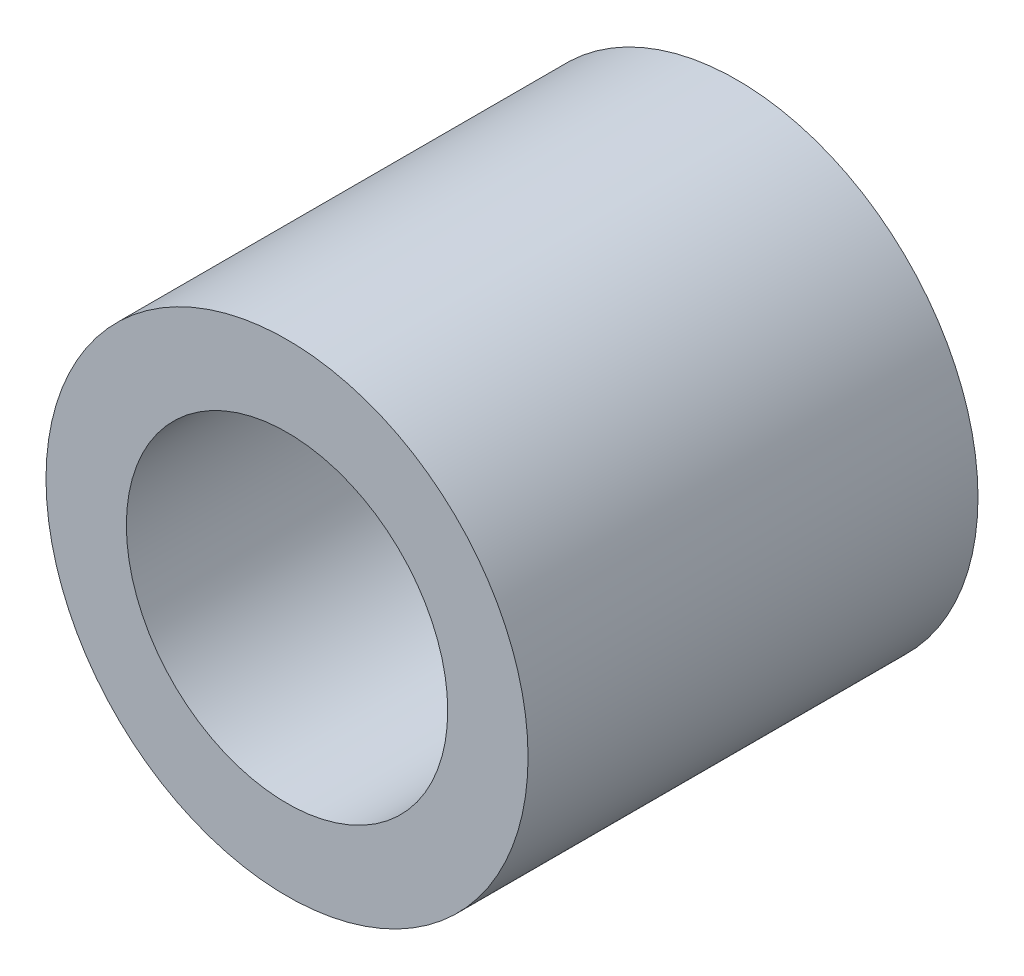
ISO-10303-21;
HEADER;
FILE_DESCRIPTION(('STEP AP214'),'2;1');
FILE_NAME('part.step','',(''),(''),'','','');
FILE_SCHEMA(('AUTOMOTIVE_DESIGN { 1 0 10303 214 1 1 1 1 }'));
ENDSEC;
DATA;
#1=APPLICATION_CONTEXT('core data for automotive mechanical design processes');
#2=APPLICATION_PROTOCOL_DEFINITION('international standard','automotive_design',2000,#1);
#3=PRODUCT_CONTEXT('',#1,'mechanical');
#4=PRODUCT('Part','Part','',(#3));
#5=PRODUCT_RELATED_PRODUCT_CATEGORY('part','',(#4));
#6=PRODUCT_DEFINITION_FORMATION('','',#4);
#7=PRODUCT_DEFINITION_CONTEXT('part definition',#1,'design');
#8=PRODUCT_DEFINITION('design','',#6,#7);
#9=PRODUCT_DEFINITION_SHAPE('','',#8);
#10=(LENGTH_UNIT() NAMED_UNIT(*) SI_UNIT(.MILLI.,.METRE.));
#11=(NAMED_UNIT(*) PLANE_ANGLE_UNIT() SI_UNIT($,.RADIAN.));
#12=(NAMED_UNIT(*) SI_UNIT($,.STERADIAN.) SOLID_ANGLE_UNIT());
#13=UNCERTAINTY_MEASURE_WITH_UNIT(LENGTH_MEASURE(1.E-05),#10,'distance_accuracy_value','');
#14=(GEOMETRIC_REPRESENTATION_CONTEXT(3) GLOBAL_UNCERTAINTY_ASSIGNED_CONTEXT((#13)) GLOBAL_UNIT_ASSIGNED_CONTEXT((#10,
#11,#12)) REPRESENTATION_CONTEXT('',''));
#15=CARTESIAN_POINT('',(0.,0.,0.));
#16=DIRECTION('',(0.,0.,1.));
#17=DIRECTION('',(1.,0.,0.));
#18=AXIS2_PLACEMENT_3D('',#15,#16,#17);
#19=CARTESIAN_POINT('',(0.,0.,7.));
#20=DIRECTION('',(0.,0.,-1.));
#21=DIRECTION('',(-1.,0.,0.));
#22=AXIS2_PLACEMENT_3D('',#19,#20,#21);
#23=CYLINDRICAL_SURFACE('',#22,3.75);
#24=CARTESIAN_POINT('',(0.,0.,7.));
#25=DIRECTION('',(0.,0.,1.));
#26=DIRECTION('',(1.,0.,0.));
#27=AXIS2_PLACEMENT_3D('',#24,#25,#26);
#28=CIRCLE('',#27,3.75);
#29=CARTESIAN_POINT('',(3.75,0.,7.));
#30=VERTEX_POINT('',#29);
#31=EDGE_CURVE('E10',#30,#30,#28,.T.);
#32=ORIENTED_EDGE('',*,*,#31,.F.);
#33=EDGE_LOOP('',(#32));
#34=FACE_BOUND('',#33,.T.);
#35=CARTESIAN_POINT('',(0.,0.,0.));
#36=DIRECTION('',(0.,0.,1.));
#37=DIRECTION('',(1.,0.,0.));
#38=AXIS2_PLACEMENT_3D('',#35,#36,#37);
#39=CIRCLE('',#38,3.75);
#40=CARTESIAN_POINT('',(3.75,0.,0.));
#41=VERTEX_POINT('',#40);
#42=EDGE_CURVE('E46',#41,#41,#39,.T.);
#43=ORIENTED_EDGE('',*,*,#42,.T.);
#44=EDGE_LOOP('',(#43));
#45=FACE_BOUND('',#44,.T.);
#46=ADVANCED_FACE('F43',(#34,#45),#23,.T.);
#47=CARTESIAN_POINT('',(0.,0.,7.));
#48=DIRECTION('',(0.,0.,1.));
#49=DIRECTION('',(1.,0.,0.));
#50=AXIS2_PLACEMENT_3D('',#47,#48,#49);
#51=PLANE('',#50);
#52=CARTESIAN_POINT('',(0.,0.,7.));
#53=DIRECTION('',(0.,0.,1.));
#54=DIRECTION('',(1.,0.,0.));
#55=AXIS2_PLACEMENT_3D('',#52,#53,#54);
#56=CIRCLE('',#55,2.5);
#57=CARTESIAN_POINT('',(2.5,0.,7.));
#58=VERTEX_POINT('',#57);
#59=EDGE_CURVE('E57',#58,#58,#56,.T.);
#60=ORIENTED_EDGE('',*,*,#59,.F.);
#61=EDGE_LOOP('',(#60));
#62=FACE_BOUND('',#61,.T.);
#63=ORIENTED_EDGE('',*,*,#31,.T.);
#64=EDGE_LOOP('',(#63));
#65=FACE_BOUND('',#64,.T.);
#66=ADVANCED_FACE('F74',(#62,#65),#51,.T.);
#67=CARTESIAN_POINT('',(0.,0.,0.));
#68=DIRECTION('',(0.,0.,1.));
#69=DIRECTION('',(1.,0.,0.));
#70=AXIS2_PLACEMENT_3D('',#67,#68,#69);
#71=PLANE('',#70);
#72=ORIENTED_EDGE('',*,*,#42,.F.);
#73=EDGE_LOOP('',(#72));
#74=FACE_BOUND('',#73,.T.);
#75=ADVANCED_FACE('F70',(#74),#71,.F.);
#76=CARTESIAN_POINT('',(0.,0.,2.));
#77=DIRECTION('',(0.,0.,1.));
#78=DIRECTION('',(1.,0.,0.));
#79=AXIS2_PLACEMENT_3D('',#76,#77,#78);
#80=CYLINDRICAL_SURFACE('',#79,2.5);
#81=CARTESIAN_POINT('',(0.,0.,2.));
#82=DIRECTION('',(0.,0.,1.));
#83=DIRECTION('',(1.,0.,0.));
#84=AXIS2_PLACEMENT_3D('',#81,#82,#83);
#85=CIRCLE('',#84,2.5);
#86=CARTESIAN_POINT('',(2.5,0.,2.));
#87=VERTEX_POINT('',#86);
#88=EDGE_CURVE('E55',#87,#87,#85,.T.);
#89=ORIENTED_EDGE('',*,*,#88,.F.);
#90=EDGE_LOOP('',(#89));
#91=FACE_BOUND('',#90,.T.);
#92=ORIENTED_EDGE('',*,*,#59,.T.);
#93=EDGE_LOOP('',(#92));
#94=FACE_BOUND('',#93,.T.);
#95=ADVANCED_FACE('F67',(#91,#94),#80,.F.);
#96=CARTESIAN_POINT('',(0.,0.,2.));
#97=DIRECTION('',(0.,0.,1.));
#98=DIRECTION('',(1.,0.,0.));
#99=AXIS2_PLACEMENT_3D('',#96,#97,#98);
#100=PLANE('',#99);
#101=ORIENTED_EDGE('',*,*,#88,.T.);
#102=EDGE_LOOP('',(#101));
#103=FACE_BOUND('',#102,.T.);
#104=ADVANCED_FACE('F65',(#103),#100,.T.);
#105=CLOSED_SHELL('',(#46,#66,#75,#95,#104));
#106=MANIFOLD_SOLID_BREP('B2',#105);
#107=ADVANCED_BREP_SHAPE_REPRESENTATION('',(#18,#106),#14);
#108=SHAPE_DEFINITION_REPRESENTATION(#9,#107);
ENDSEC;
END-ISO-10303-21;
